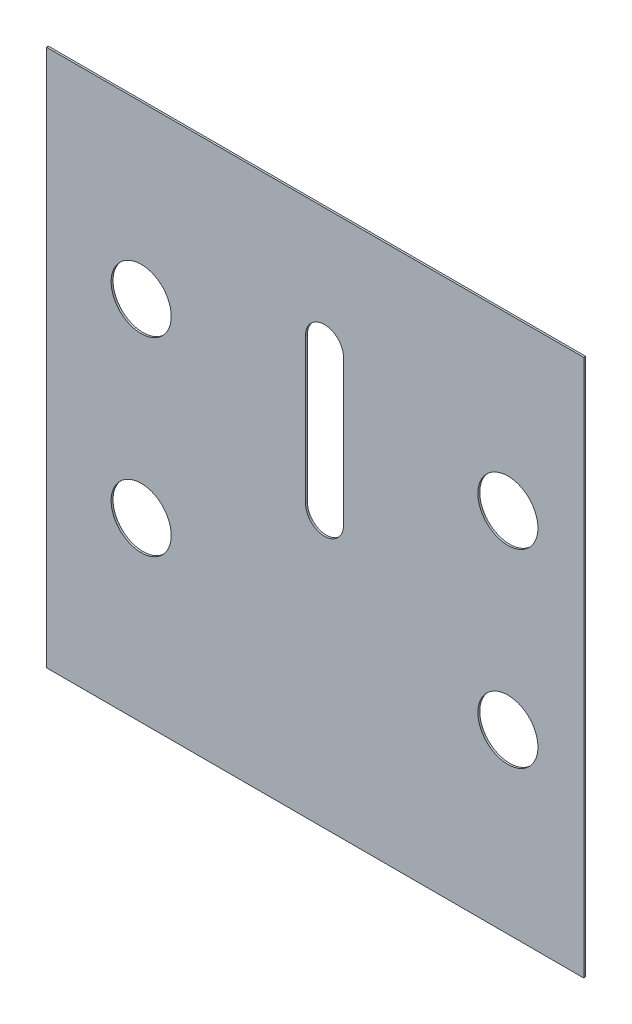
ISO-10303-21;
HEADER;
FILE_DESCRIPTION(('STEP AP214'),'2;1');
FILE_NAME('part.step','',(''),(''),'','','');
FILE_SCHEMA(('AUTOMOTIVE_DESIGN { 1 0 10303 214 1 1 1 1 }'));
ENDSEC;
DATA;
#1=APPLICATION_CONTEXT('core data for automotive mechanical design processes');
#2=APPLICATION_PROTOCOL_DEFINITION('international standard','automotive_design',2000,#1);
#3=PRODUCT_CONTEXT('',#1,'mechanical');
#4=PRODUCT('Part','Part','',(#3));
#5=PRODUCT_RELATED_PRODUCT_CATEGORY('part','',(#4));
#6=PRODUCT_DEFINITION_FORMATION('','',#4);
#7=PRODUCT_DEFINITION_CONTEXT('part definition',#1,'design');
#8=PRODUCT_DEFINITION('design','',#6,#7);
#9=PRODUCT_DEFINITION_SHAPE('','',#8);
#10=(LENGTH_UNIT() NAMED_UNIT(*) SI_UNIT(.MILLI.,.METRE.));
#11=(NAMED_UNIT(*) PLANE_ANGLE_UNIT() SI_UNIT($,.RADIAN.));
#12=(NAMED_UNIT(*) SI_UNIT($,.STERADIAN.) SOLID_ANGLE_UNIT());
#13=UNCERTAINTY_MEASURE_WITH_UNIT(LENGTH_MEASURE(1.E-05),#10,'distance_accuracy_value','');
#14=(GEOMETRIC_REPRESENTATION_CONTEXT(3) GLOBAL_UNCERTAINTY_ASSIGNED_CONTEXT((#13)) GLOBAL_UNIT_ASSIGNED_CONTEXT((#10,
#11,#12)) REPRESENTATION_CONTEXT('',''));
#15=CARTESIAN_POINT('',(0.,0.,0.));
#16=DIRECTION('',(0.,0.,1.));
#17=DIRECTION('',(1.,0.,0.));
#18=AXIS2_PLACEMENT_3D('',#15,#16,#17);
#19=CARTESIAN_POINT('',(-2.79318668888751E-12,850.,3.));
#20=DIRECTION('',(1.,0.,0.));
#21=DIRECTION('',(0.,0.,-1.));
#22=AXIS2_PLACEMENT_3D('',#19,#20,#21);
#23=PLANE('',#22);
#24=DIRECTION('',(0.,-1.,0.));
#25=VECTOR('',#24,1.);
#26=CARTESIAN_POINT('',(-2.79318668888751E-12,850.,0.));
#27=LINE('',#26,#25);
#28=CARTESIAN_POINT('',(-2.79318668888751E-12,850.,0.));
#29=VERTEX_POINT('',#28);
#30=CARTESIAN_POINT('',(-2.79318668888751E-12,0.,0.));
#31=VERTEX_POINT('',#30);
#32=EDGE_CURVE('E156',#29,#31,#27,.T.);
#33=ORIENTED_EDGE('',*,*,#32,.T.);
#34=DIRECTION('',(0.,0.,-1.));
#35=VECTOR('',#34,1.);
#36=CARTESIAN_POINT('',(-2.79318668888751E-12,0.,3.));
#37=LINE('',#36,#35);
#38=CARTESIAN_POINT('',(-2.79318668888751E-12,0.,3.));
#39=VERTEX_POINT('',#38);
#40=EDGE_CURVE('E11',#39,#31,#37,.T.);
#41=ORIENTED_EDGE('',*,*,#40,.F.);
#42=DIRECTION('',(0.,-1.,0.));
#43=VECTOR('',#42,1.);
#44=CARTESIAN_POINT('',(-2.79318668888751E-12,850.,3.));
#45=LINE('',#44,#43);
#46=CARTESIAN_POINT('',(-2.79318668888751E-12,850.,3.));
#47=VERTEX_POINT('',#46);
#48=EDGE_CURVE('E159',#47,#39,#45,.T.);
#49=ORIENTED_EDGE('',*,*,#48,.F.);
#50=DIRECTION('',(0.,0.,-1.));
#51=VECTOR('',#50,1.);
#52=CARTESIAN_POINT('',(-2.79318668888751E-12,850.,3.));
#53=LINE('',#52,#51);
#54=EDGE_CURVE('E169',#47,#29,#53,.T.);
#55=ORIENTED_EDGE('',*,*,#54,.T.);
#56=EDGE_LOOP('',(#33,#41,#49,#55));
#57=FACE_BOUND('',#56,.T.);
#58=ADVANCED_FACE('F34',(#57),#23,.F.);
#59=CARTESIAN_POINT('',(-2.79318668888751E-12,0.,3.));
#60=DIRECTION('',(0.,1.,0.));
#61=DIRECTION('',(0.,0.,1.));
#62=AXIS2_PLACEMENT_3D('',#59,#60,#61);
#63=PLANE('',#62);
#64=DIRECTION('',(1.,0.,0.));
#65=VECTOR('',#64,1.);
#66=CARTESIAN_POINT('',(-2.79318668888751E-12,0.,0.));
#67=LINE('',#66,#65);
#68=CARTESIAN_POINT('',(850.,0.,0.));
#69=VERTEX_POINT('',#68);
#70=EDGE_CURVE('E172',#31,#69,#67,.T.);
#71=ORIENTED_EDGE('',*,*,#70,.T.);
#72=DIRECTION('',(0.,0.,-1.));
#73=VECTOR('',#72,1.);
#74=CARTESIAN_POINT('',(850.,0.,3.));
#75=LINE('',#74,#73);
#76=CARTESIAN_POINT('',(850.,0.,3.));
#77=VERTEX_POINT('',#76);
#78=EDGE_CURVE('E41',#77,#69,#75,.T.);
#79=ORIENTED_EDGE('',*,*,#78,.F.);
#80=DIRECTION('',(1.,0.,0.));
#81=VECTOR('',#80,1.);
#82=CARTESIAN_POINT('',(-2.79318668888751E-12,0.,3.));
#83=LINE('',#82,#81);
#84=EDGE_CURVE('E162',#39,#77,#83,.T.);
#85=ORIENTED_EDGE('',*,*,#84,.F.);
#86=ORIENTED_EDGE('',*,*,#40,.T.);
#87=EDGE_LOOP('',(#71,#79,#85,#86));
#88=FACE_BOUND('',#87,.T.);
#89=ADVANCED_FACE('F201',(#88),#63,.F.);
#90=CARTESIAN_POINT('',(850.,850.,3.));
#91=DIRECTION('',(-1.,0.,0.));
#92=DIRECTION('',(0.,0.,1.));
#93=AXIS2_PLACEMENT_3D('',#90,#91,#92);
#94=PLANE('',#93);
#95=DIRECTION('',(0.,1.,0.));
#96=VECTOR('',#95,1.);
#97=CARTESIAN_POINT('',(850.,850.,0.));
#98=LINE('',#97,#96);
#99=CARTESIAN_POINT('',(850.,850.,0.));
#100=VERTEX_POINT('',#99);
#101=EDGE_CURVE('E174',#69,#100,#98,.T.);
#102=ORIENTED_EDGE('',*,*,#101,.T.);
#103=DIRECTION('',(0.,0.,-1.));
#104=VECTOR('',#103,1.);
#105=CARTESIAN_POINT('',(850.,850.,3.));
#106=LINE('',#105,#104);
#107=CARTESIAN_POINT('',(850.,850.,3.));
#108=VERTEX_POINT('',#107);
#109=EDGE_CURVE('E179',#108,#100,#106,.T.);
#110=ORIENTED_EDGE('',*,*,#109,.F.);
#111=DIRECTION('',(0.,1.,0.));
#112=VECTOR('',#111,1.);
#113=CARTESIAN_POINT('',(850.,850.,3.));
#114=LINE('',#113,#112);
#115=EDGE_CURVE('E165',#77,#108,#114,.T.);
#116=ORIENTED_EDGE('',*,*,#115,.F.);
#117=ORIENTED_EDGE('',*,*,#78,.T.);
#118=EDGE_LOOP('',(#102,#110,#116,#117));
#119=FACE_BOUND('',#118,.T.);
#120=ADVANCED_FACE('F186',(#119),#94,.F.);
#121=CARTESIAN_POINT('',(-2.79318668888751E-12,850.,3.));
#122=DIRECTION('',(0.,-1.,0.));
#123=DIRECTION('',(0.,0.,-1.));
#124=AXIS2_PLACEMENT_3D('',#121,#122,#123);
#125=PLANE('',#124);
#126=DIRECTION('',(-1.,0.,0.));
#127=VECTOR('',#126,1.);
#128=CARTESIAN_POINT('',(-2.79318668888751E-12,850.,0.));
#129=LINE('',#128,#127);
#130=EDGE_CURVE('E163',#100,#29,#129,.T.);
#131=ORIENTED_EDGE('',*,*,#130,.T.);
#132=ORIENTED_EDGE('',*,*,#54,.F.);
#133=DIRECTION('',(-1.,0.,0.));
#134=VECTOR('',#133,1.);
#135=CARTESIAN_POINT('',(-2.79318668888751E-12,850.,3.));
#136=LINE('',#135,#134);
#137=EDGE_CURVE('E167',#108,#47,#136,.T.);
#138=ORIENTED_EDGE('',*,*,#137,.F.);
#139=ORIENTED_EDGE('',*,*,#109,.T.);
#140=EDGE_LOOP('',(#131,#132,#138,#139));
#141=FACE_BOUND('',#140,.T.);
#142=ADVANCED_FACE('F194',(#141),#125,.F.);
#143=CARTESIAN_POINT('',(0.,0.,3.));
#144=DIRECTION('',(0.,0.,1.));
#145=DIRECTION('',(1.,0.,0.));
#146=AXIS2_PLACEMENT_3D('',#143,#144,#145);
#147=PLANE('',#146);
#148=CARTESIAN_POINT('',(439.999999999997,660.,3.));
#149=DIRECTION('',(0.,0.,1.));
#150=DIRECTION('',(1.,0.,0.));
#151=AXIS2_PLACEMENT_3D('',#148,#149,#150);
#152=CIRCLE('',#151,30.);
#153=CARTESIAN_POINT('',(469.999999999997,660.,3.));
#154=VERTEX_POINT('',#153);
#155=CARTESIAN_POINT('',(409.999999999997,660.,3.));
#156=VERTEX_POINT('',#155);
#157=EDGE_CURVE('E48',#154,#156,#152,.T.);
#158=ORIENTED_EDGE('',*,*,#157,.F.);
#159=DIRECTION('',(0.,1.,0.));
#160=VECTOR('',#159,1.);
#161=CARTESIAN_POINT('',(469.999999999997,660.,3.));
#162=LINE('',#161,#160);
#163=CARTESIAN_POINT('',(469.999999999997,430.,3.));
#164=VERTEX_POINT('',#163);
#165=EDGE_CURVE('E116',#164,#154,#162,.T.);
#166=ORIENTED_EDGE('',*,*,#165,.F.);
#167=CARTESIAN_POINT('',(439.999999999997,430.,3.));
#168=DIRECTION('',(0.,0.,1.));
#169=DIRECTION('',(1.,0.,0.));
#170=AXIS2_PLACEMENT_3D('',#167,#168,#169);
#171=CIRCLE('',#170,29.9999999999999);
#172=CARTESIAN_POINT('',(409.999999999997,430.,3.));
#173=VERTEX_POINT('',#172);
#174=EDGE_CURVE('E119',#173,#164,#171,.T.);
#175=ORIENTED_EDGE('',*,*,#174,.F.);
#176=DIRECTION('',(0.,-1.,0.));
#177=VECTOR('',#176,1.);
#178=CARTESIAN_POINT('',(409.999999999997,660.,3.));
#179=LINE('',#178,#177);
#180=EDGE_CURVE('E125',#156,#173,#179,.T.);
#181=ORIENTED_EDGE('',*,*,#180,.F.);
#182=EDGE_LOOP('',(#158,#166,#175,#181));
#183=FACE_BOUND('',#182,.T.);
#184=CARTESIAN_POINT('',(729.999999999997,580.,3.));
#185=DIRECTION('',(0.,0.,1.));
#186=DIRECTION('',(1.,0.,0.));
#187=AXIS2_PLACEMENT_3D('',#184,#185,#186);
#188=CIRCLE('',#187,47.5);
#189=CARTESIAN_POINT('',(777.499999999997,580.,3.));
#190=VERTEX_POINT('',#189);
#191=EDGE_CURVE('E131',#190,#190,#188,.T.);
#192=ORIENTED_EDGE('',*,*,#191,.F.);
#193=EDGE_LOOP('',(#192));
#194=FACE_BOUND('',#193,.T.);
#195=CARTESIAN_POINT('',(729.999999999997,280.,3.));
#196=DIRECTION('',(0.,0.,1.));
#197=DIRECTION('',(1.,0.,0.));
#198=AXIS2_PLACEMENT_3D('',#195,#196,#197);
#199=CIRCLE('',#198,47.5);
#200=CARTESIAN_POINT('',(777.499999999997,280.,3.));
#201=VERTEX_POINT('',#200);
#202=EDGE_CURVE('E138',#201,#201,#199,.T.);
#203=ORIENTED_EDGE('',*,*,#202,.F.);
#204=EDGE_LOOP('',(#203));
#205=FACE_BOUND('',#204,.T.);
#206=CARTESIAN_POINT('',(149.999999999997,280.,3.));
#207=DIRECTION('',(0.,0.,1.));
#208=DIRECTION('',(1.,0.,0.));
#209=AXIS2_PLACEMENT_3D('',#206,#207,#208);
#210=CIRCLE('',#209,47.5);
#211=CARTESIAN_POINT('',(197.499999999997,280.,3.));
#212=VERTEX_POINT('',#211);
#213=EDGE_CURVE('E144',#212,#212,#210,.T.);
#214=ORIENTED_EDGE('',*,*,#213,.F.);
#215=EDGE_LOOP('',(#214));
#216=FACE_BOUND('',#215,.T.);
#217=CARTESIAN_POINT('',(149.999999999997,580.,3.));
#218=DIRECTION('',(0.,0.,1.));
#219=DIRECTION('',(1.,0.,0.));
#220=AXIS2_PLACEMENT_3D('',#217,#218,#219);
#221=CIRCLE('',#220,47.5);
#222=CARTESIAN_POINT('',(197.499999999997,580.,3.));
#223=VERTEX_POINT('',#222);
#224=EDGE_CURVE('E150',#223,#223,#221,.T.);
#225=ORIENTED_EDGE('',*,*,#224,.F.);
#226=EDGE_LOOP('',(#225));
#227=FACE_BOUND('',#226,.T.);
#228=ORIENTED_EDGE('',*,*,#48,.T.);
#229=ORIENTED_EDGE('',*,*,#84,.T.);
#230=ORIENTED_EDGE('',*,*,#115,.T.);
#231=ORIENTED_EDGE('',*,*,#137,.T.);
#232=EDGE_LOOP('',(#228,#229,#230,#231));
#233=FACE_BOUND('',#232,.T.);
#234=ADVANCED_FACE('F200',(#183,#194,#205,#216,#227,#233),#147,.T.);
#235=CARTESIAN_POINT('',(0.,0.,0.));
#236=DIRECTION('',(0.,0.,1.));
#237=DIRECTION('',(1.,0.,0.));
#238=AXIS2_PLACEMENT_3D('',#235,#236,#237);
#239=PLANE('',#238);
#240=DIRECTION('',(0.,1.,0.));
#241=VECTOR('',#240,1.);
#242=CARTESIAN_POINT('',(469.999999999997,660.,0.));
#243=LINE('',#242,#241);
#244=CARTESIAN_POINT('',(469.999999999997,430.,0.));
#245=VERTEX_POINT('',#244);
#246=CARTESIAN_POINT('',(469.999999999997,660.,0.));
#247=VERTEX_POINT('',#246);
#248=EDGE_CURVE('E106',#245,#247,#243,.T.);
#249=ORIENTED_EDGE('',*,*,#248,.T.);
#250=CARTESIAN_POINT('',(439.999999999997,660.,0.));
#251=DIRECTION('',(0.,0.,1.));
#252=DIRECTION('',(1.,0.,0.));
#253=AXIS2_PLACEMENT_3D('',#250,#251,#252);
#254=CIRCLE('',#253,30.);
#255=CARTESIAN_POINT('',(409.999999999997,660.,0.));
#256=VERTEX_POINT('',#255);
#257=EDGE_CURVE('E100',#247,#256,#254,.T.);
#258=ORIENTED_EDGE('',*,*,#257,.T.);
#259=DIRECTION('',(0.,-1.,0.));
#260=VECTOR('',#259,1.);
#261=CARTESIAN_POINT('',(409.999999999997,660.,0.));
#262=LINE('',#261,#260);
#263=CARTESIAN_POINT('',(409.999999999997,430.,0.));
#264=VERTEX_POINT('',#263);
#265=EDGE_CURVE('E109',#256,#264,#262,.T.);
#266=ORIENTED_EDGE('',*,*,#265,.T.);
#267=CARTESIAN_POINT('',(439.999999999997,430.,0.));
#268=DIRECTION('',(0.,0.,1.));
#269=DIRECTION('',(1.,0.,0.));
#270=AXIS2_PLACEMENT_3D('',#267,#268,#269);
#271=CIRCLE('',#270,29.9999999999999);
#272=EDGE_CURVE('E56',#264,#245,#271,.T.);
#273=ORIENTED_EDGE('',*,*,#272,.T.);
#274=EDGE_LOOP('',(#249,#258,#266,#273));
#275=FACE_BOUND('',#274,.T.);
#276=CARTESIAN_POINT('',(729.999999999997,580.,0.));
#277=DIRECTION('',(0.,0.,1.));
#278=DIRECTION('',(1.,0.,0.));
#279=AXIS2_PLACEMENT_3D('',#276,#277,#278);
#280=CIRCLE('',#279,47.5);
#281=CARTESIAN_POINT('',(777.499999999997,580.,0.));
#282=VERTEX_POINT('',#281);
#283=EDGE_CURVE('E135',#282,#282,#280,.T.);
#284=ORIENTED_EDGE('',*,*,#283,.T.);
#285=EDGE_LOOP('',(#284));
#286=FACE_BOUND('',#285,.T.);
#287=CARTESIAN_POINT('',(729.999999999997,280.,0.));
#288=DIRECTION('',(0.,0.,1.));
#289=DIRECTION('',(1.,0.,0.));
#290=AXIS2_PLACEMENT_3D('',#287,#288,#289);
#291=CIRCLE('',#290,47.5);
#292=CARTESIAN_POINT('',(777.499999999997,280.,0.));
#293=VERTEX_POINT('',#292);
#294=EDGE_CURVE('E141',#293,#293,#291,.T.);
#295=ORIENTED_EDGE('',*,*,#294,.T.);
#296=EDGE_LOOP('',(#295));
#297=FACE_BOUND('',#296,.T.);
#298=CARTESIAN_POINT('',(149.999999999997,280.,0.));
#299=DIRECTION('',(0.,0.,1.));
#300=DIRECTION('',(1.,0.,0.));
#301=AXIS2_PLACEMENT_3D('',#298,#299,#300);
#302=CIRCLE('',#301,47.5);
#303=CARTESIAN_POINT('',(197.499999999997,280.,0.));
#304=VERTEX_POINT('',#303);
#305=EDGE_CURVE('E147',#304,#304,#302,.T.);
#306=ORIENTED_EDGE('',*,*,#305,.T.);
#307=EDGE_LOOP('',(#306));
#308=FACE_BOUND('',#307,.T.);
#309=CARTESIAN_POINT('',(149.999999999997,580.,0.));
#310=DIRECTION('',(0.,0.,1.));
#311=DIRECTION('',(1.,0.,0.));
#312=AXIS2_PLACEMENT_3D('',#309,#310,#311);
#313=CIRCLE('',#312,47.5);
#314=CARTESIAN_POINT('',(197.499999999997,580.,0.));
#315=VERTEX_POINT('',#314);
#316=EDGE_CURVE('E153',#315,#315,#313,.T.);
#317=ORIENTED_EDGE('',*,*,#316,.T.);
#318=EDGE_LOOP('',(#317));
#319=FACE_BOUND('',#318,.T.);
#320=ORIENTED_EDGE('',*,*,#32,.F.);
#321=ORIENTED_EDGE('',*,*,#130,.F.);
#322=ORIENTED_EDGE('',*,*,#101,.F.);
#323=ORIENTED_EDGE('',*,*,#70,.F.);
#324=EDGE_LOOP('',(#320,#321,#322,#323));
#325=FACE_BOUND('',#324,.T.);
#326=ADVANCED_FACE('F113',(#275,#286,#297,#308,#319,#325),#239,.F.);
#327=CARTESIAN_POINT('',(149.999999999997,580.,0.));
#328=DIRECTION('',(0.,0.,1.));
#329=DIRECTION('',(1.,0.,0.));
#330=AXIS2_PLACEMENT_3D('',#327,#328,#329);
#331=CYLINDRICAL_SURFACE('',#330,47.5);
#332=ORIENTED_EDGE('',*,*,#316,.F.);
#333=EDGE_LOOP('',(#332));
#334=FACE_BOUND('',#333,.T.);
#335=ORIENTED_EDGE('',*,*,#224,.T.);
#336=EDGE_LOOP('',(#335));
#337=FACE_BOUND('',#336,.T.);
#338=ADVANCED_FACE('F213',(#334,#337),#331,.F.);
#339=CARTESIAN_POINT('',(149.999999999997,280.,0.));
#340=DIRECTION('',(0.,0.,1.));
#341=DIRECTION('',(1.,0.,0.));
#342=AXIS2_PLACEMENT_3D('',#339,#340,#341);
#343=CYLINDRICAL_SURFACE('',#342,47.5);
#344=ORIENTED_EDGE('',*,*,#305,.F.);
#345=EDGE_LOOP('',(#344));
#346=FACE_BOUND('',#345,.T.);
#347=ORIENTED_EDGE('',*,*,#213,.T.);
#348=EDGE_LOOP('',(#347));
#349=FACE_BOUND('',#348,.T.);
#350=ADVANCED_FACE('F219',(#346,#349),#343,.F.);
#351=CARTESIAN_POINT('',(729.999999999997,280.,0.));
#352=DIRECTION('',(0.,0.,1.));
#353=DIRECTION('',(1.,0.,0.));
#354=AXIS2_PLACEMENT_3D('',#351,#352,#353);
#355=CYLINDRICAL_SURFACE('',#354,47.5);
#356=ORIENTED_EDGE('',*,*,#294,.F.);
#357=EDGE_LOOP('',(#356));
#358=FACE_BOUND('',#357,.T.);
#359=ORIENTED_EDGE('',*,*,#202,.T.);
#360=EDGE_LOOP('',(#359));
#361=FACE_BOUND('',#360,.T.);
#362=ADVANCED_FACE('F223',(#358,#361),#355,.F.);
#363=CARTESIAN_POINT('',(729.999999999997,580.,0.));
#364=DIRECTION('',(0.,0.,1.));
#365=DIRECTION('',(1.,0.,0.));
#366=AXIS2_PLACEMENT_3D('',#363,#364,#365);
#367=CYLINDRICAL_SURFACE('',#366,47.5);
#368=ORIENTED_EDGE('',*,*,#283,.F.);
#369=EDGE_LOOP('',(#368));
#370=FACE_BOUND('',#369,.T.);
#371=ORIENTED_EDGE('',*,*,#191,.T.);
#372=EDGE_LOOP('',(#371));
#373=FACE_BOUND('',#372,.T.);
#374=ADVANCED_FACE('F227',(#370,#373),#367,.F.);
#375=CARTESIAN_POINT('',(439.999999999997,660.,0.));
#376=DIRECTION('',(0.,0.,1.));
#377=DIRECTION('',(1.,0.,0.));
#378=AXIS2_PLACEMENT_3D('',#375,#376,#377);
#379=CYLINDRICAL_SURFACE('',#378,30.);
#380=ORIENTED_EDGE('',*,*,#157,.T.);
#381=DIRECTION('',(0.,0.,1.));
#382=VECTOR('',#381,1.);
#383=CARTESIAN_POINT('',(409.999999999997,660.,0.));
#384=LINE('',#383,#382);
#385=EDGE_CURVE('E96',#256,#156,#384,.T.);
#386=ORIENTED_EDGE('',*,*,#385,.F.);
#387=ORIENTED_EDGE('',*,*,#257,.F.);
#388=DIRECTION('',(0.,0.,1.));
#389=VECTOR('',#388,1.);
#390=CARTESIAN_POINT('',(469.999999999997,660.,0.));
#391=LINE('',#390,#389);
#392=EDGE_CURVE('E129',#247,#154,#391,.T.);
#393=ORIENTED_EDGE('',*,*,#392,.T.);
#394=EDGE_LOOP('',(#380,#386,#387,#393));
#395=FACE_BOUND('',#394,.T.);
#396=ADVANCED_FACE('F98',(#395),#379,.F.);
#397=CARTESIAN_POINT('',(469.999999999997,660.,0.));
#398=DIRECTION('',(1.,0.,0.));
#399=DIRECTION('',(0.,0.,-1.));
#400=AXIS2_PLACEMENT_3D('',#397,#398,#399);
#401=PLANE('',#400);
#402=ORIENTED_EDGE('',*,*,#165,.T.);
#403=ORIENTED_EDGE('',*,*,#392,.F.);
#404=ORIENTED_EDGE('',*,*,#248,.F.);
#405=DIRECTION('',(0.,0.,1.));
#406=VECTOR('',#405,1.);
#407=CARTESIAN_POINT('',(469.999999999997,430.,0.));
#408=LINE('',#407,#406);
#409=EDGE_CURVE('E132',#245,#164,#408,.T.);
#410=ORIENTED_EDGE('',*,*,#409,.T.);
#411=EDGE_LOOP('',(#402,#403,#404,#410));
#412=FACE_BOUND('',#411,.T.);
#413=ADVANCED_FACE('F234',(#412),#401,.F.);
#414=CARTESIAN_POINT('',(439.999999999997,430.,0.));
#415=DIRECTION('',(0.,0.,1.));
#416=DIRECTION('',(1.,0.,0.));
#417=AXIS2_PLACEMENT_3D('',#414,#415,#416);
#418=CYLINDRICAL_SURFACE('',#417,29.9999999999999);
#419=ORIENTED_EDGE('',*,*,#174,.T.);
#420=ORIENTED_EDGE('',*,*,#409,.F.);
#421=ORIENTED_EDGE('',*,*,#272,.F.);
#422=DIRECTION('',(0.,0.,1.));
#423=VECTOR('',#422,1.);
#424=CARTESIAN_POINT('',(409.999999999997,430.,0.));
#425=LINE('',#424,#423);
#426=EDGE_CURVE('E105',#264,#173,#425,.T.);
#427=ORIENTED_EDGE('',*,*,#426,.T.);
#428=EDGE_LOOP('',(#419,#420,#421,#427));
#429=FACE_BOUND('',#428,.T.);
#430=ADVANCED_FACE('F237',(#429),#418,.F.);
#431=CARTESIAN_POINT('',(409.999999999997,660.,0.));
#432=DIRECTION('',(-1.,0.,0.));
#433=DIRECTION('',(0.,-1.,0.));
#434=AXIS2_PLACEMENT_3D('',#431,#432,#433);
#435=PLANE('',#434);
#436=ORIENTED_EDGE('',*,*,#180,.T.);
#437=ORIENTED_EDGE('',*,*,#426,.F.);
#438=ORIENTED_EDGE('',*,*,#265,.F.);
#439=ORIENTED_EDGE('',*,*,#385,.T.);
#440=EDGE_LOOP('',(#436,#437,#438,#439));
#441=FACE_BOUND('',#440,.T.);
#442=ADVANCED_FACE('F110',(#441),#435,.F.);
#443=CLOSED_SHELL('',(#58,#89,#120,#142,#234,#326,#338,#350,#362,#374,#396,#413,#430,#442));
#444=MANIFOLD_SOLID_BREP('B2',#443);
#445=ADVANCED_BREP_SHAPE_REPRESENTATION('',(#18,#444),#14);
#446=SHAPE_DEFINITION_REPRESENTATION(#9,#445);
ENDSEC;
END-ISO-10303-21;
